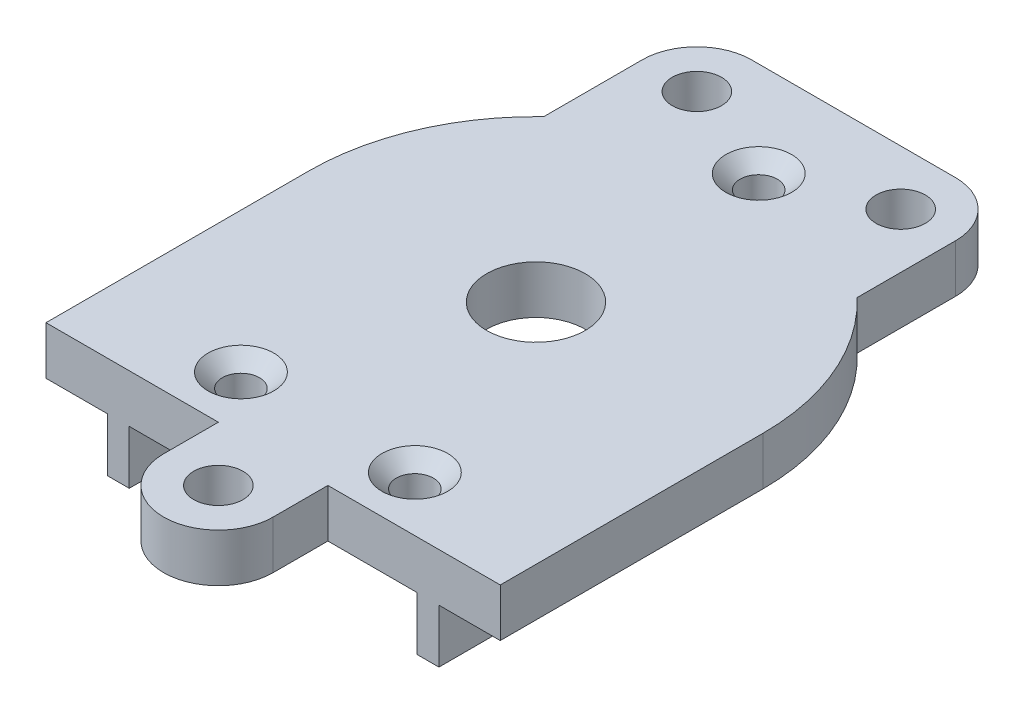
ISO-10303-21;
HEADER;
FILE_DESCRIPTION(('STEP AP214'),'2;1');
FILE_NAME('part.step','',(''),(''),'','','');
FILE_SCHEMA(('AUTOMOTIVE_DESIGN { 1 0 10303 214 1 1 1 1 }'));
ENDSEC;
DATA;
#1=APPLICATION_CONTEXT('core data for automotive mechanical design processes');
#2=APPLICATION_PROTOCOL_DEFINITION('international standard','automotive_design',2000,#1);
#3=PRODUCT_CONTEXT('',#1,'mechanical');
#4=PRODUCT('Part','Part','',(#3));
#5=PRODUCT_RELATED_PRODUCT_CATEGORY('part','',(#4));
#6=PRODUCT_DEFINITION_FORMATION('','',#4);
#7=PRODUCT_DEFINITION_CONTEXT('part definition',#1,'design');
#8=PRODUCT_DEFINITION('design','',#6,#7);
#9=PRODUCT_DEFINITION_SHAPE('','',#8);
#10=(LENGTH_UNIT() NAMED_UNIT(*) SI_UNIT(.MILLI.,.METRE.));
#11=(NAMED_UNIT(*) PLANE_ANGLE_UNIT() SI_UNIT($,.RADIAN.));
#12=(NAMED_UNIT(*) SI_UNIT($,.STERADIAN.) SOLID_ANGLE_UNIT());
#13=UNCERTAINTY_MEASURE_WITH_UNIT(LENGTH_MEASURE(1.E-05),#10,'distance_accuracy_value','');
#14=(GEOMETRIC_REPRESENTATION_CONTEXT(3) GLOBAL_UNCERTAINTY_ASSIGNED_CONTEXT((#13)) GLOBAL_UNIT_ASSIGNED_CONTEXT((#10,
#11,#12)) REPRESENTATION_CONTEXT('',''));
#15=CARTESIAN_POINT('',(0.,0.,0.));
#16=DIRECTION('',(0.,0.,1.));
#17=DIRECTION('',(1.,0.,0.));
#18=AXIS2_PLACEMENT_3D('',#15,#16,#17);
#19=CARTESIAN_POINT('',(0.,5.3,0.));
#20=DIRECTION('',(0.,1.,0.));
#21=DIRECTION('',(0.,0.,1.));
#22=AXIS2_PLACEMENT_3D('',#19,#20,#21);
#23=PLANE('',#22);
#24=CARTESIAN_POINT('',(-4.65334875921136,5.3,-11.9993018682399));
#25=DIRECTION('',(0.,-1.,0.));
#26=DIRECTION('',(0.,0.,-1.));
#27=AXIS2_PLACEMENT_3D('',#24,#25,#26);
#28=CIRCLE('',#27,1.49999954);
#29=CARTESIAN_POINT('',(-4.65334875921136,5.3,-13.4993014082399));
#30=VERTEX_POINT('',#29);
#31=EDGE_CURVE('E1128',#30,#30,#28,.T.);
#32=ORIENTED_EDGE('',*,*,#31,.F.);
#33=EDGE_LOOP('',(#32));
#34=FACE_BOUND('',#33,.T.);
#35=DIRECTION('',(0.,0.,1.));
#36=VECTOR('',#35,1.);
#37=CARTESIAN_POINT('',(7.15334875921134,5.3,0.));
#38=LINE('',#37,#36);
#39=CARTESIAN_POINT('',(7.15334875921136,5.3,-11.9993018682399));
#40=VERTEX_POINT('',#39);
#41=CARTESIAN_POINT('',(7.15334875921135,5.3,-7.50776275125216));
#42=VERTEX_POINT('',#41);
#43=EDGE_CURVE('E249',#40,#42,#38,.T.);
#44=ORIENTED_EDGE('',*,*,#43,.T.);
#45=CARTESIAN_POINT('',(0.,5.3,0.));
#46=DIRECTION('',(0.,1.,0.));
#47=DIRECTION('',(0.,0.,1.));
#48=AXIS2_PLACEMENT_3D('',#45,#46,#47);
#49=CIRCLE('',#48,10.37);
#50=CARTESIAN_POINT('',(10.37,5.3,0.));
#51=VERTEX_POINT('',#50);
#52=EDGE_CURVE('E427',#51,#42,#49,.T.);
#53=ORIENTED_EDGE('',*,*,#52,.F.);
#54=DIRECTION('',(0.,0.,1.));
#55=VECTOR('',#54,1.);
#56=CARTESIAN_POINT('',(10.37,5.3,0.));
#57=LINE('',#56,#55);
#58=CARTESIAN_POINT('',(10.37,5.3,12.));
#59=VERTEX_POINT('',#58);
#60=EDGE_CURVE('E421',#51,#59,#57,.T.);
#61=ORIENTED_EDGE('',*,*,#60,.T.);
#62=DIRECTION('',(1.,0.,0.));
#63=VECTOR('',#62,1.);
#64=CARTESIAN_POINT('',(-10.37,5.3,12.));
#65=LINE('',#64,#63);
#66=CARTESIAN_POINT('',(7.56999999999999,5.3,12.));
#67=VERTEX_POINT('',#66);
#68=EDGE_CURVE('E449',#67,#59,#65,.T.);
#69=ORIENTED_EDGE('',*,*,#68,.F.);
#70=DIRECTION('',(0.,0.,1.));
#71=VECTOR('',#70,1.);
#72=CARTESIAN_POINT('',(7.57,5.3,0.));
#73=LINE('',#72,#71);
#74=CARTESIAN_POINT('',(7.57,5.3,0.));
#75=VERTEX_POINT('',#74);
#76=EDGE_CURVE('E375',#75,#67,#73,.T.);
#77=ORIENTED_EDGE('',*,*,#76,.F.);
#78=CARTESIAN_POINT('',(0.,5.3,0.));
#79=DIRECTION('',(0.,-1.,0.));
#80=DIRECTION('',(0.,0.,-1.));
#81=AXIS2_PLACEMENT_3D('',#78,#79,#80);
#82=CIRCLE('',#81,7.57);
#83=CARTESIAN_POINT('',(-7.57,5.3,0.));
#84=VERTEX_POINT('',#83);
#85=EDGE_CURVE('E371',#84,#75,#82,.T.);
#86=ORIENTED_EDGE('',*,*,#85,.F.);
#87=DIRECTION('',(0.,0.,1.));
#88=VECTOR('',#87,1.);
#89=CARTESIAN_POINT('',(-7.57,5.3,0.));
#90=LINE('',#89,#88);
#91=CARTESIAN_POINT('',(-7.57,5.3,12.));
#92=VERTEX_POINT('',#91);
#93=EDGE_CURVE('E338',#84,#92,#90,.T.);
#94=ORIENTED_EDGE('',*,*,#93,.T.);
#95=CARTESIAN_POINT('',(-10.37,5.3,12.));
#96=VERTEX_POINT('',#95);
#97=EDGE_CURVE('E450',#96,#92,#65,.T.);
#98=ORIENTED_EDGE('',*,*,#97,.F.);
#99=DIRECTION('',(0.,0.,1.));
#100=VECTOR('',#99,1.);
#101=CARTESIAN_POINT('',(-10.37,5.3,0.));
#102=LINE('',#101,#100);
#103=CARTESIAN_POINT('',(-10.37,5.3,0.));
#104=VERTEX_POINT('',#103);
#105=EDGE_CURVE('E438',#104,#96,#102,.T.);
#106=ORIENTED_EDGE('',*,*,#105,.F.);
#107=CARTESIAN_POINT('',(-7.15334875921136,5.3,-7.50776275125215));
#108=VERTEX_POINT('',#107);
#109=EDGE_CURVE('E431',#108,#104,#49,.T.);
#110=ORIENTED_EDGE('',*,*,#109,.F.);
#111=DIRECTION('',(0.,0.,1.));
#112=VECTOR('',#111,1.);
#113=CARTESIAN_POINT('',(-7.15334875921136,5.3,0.));
#114=LINE('',#113,#112);
#115=CARTESIAN_POINT('',(-7.15334875921136,5.3,-11.9993018682399));
#116=VERTEX_POINT('',#115);
#117=EDGE_CURVE('E269',#116,#108,#114,.T.);
#118=ORIENTED_EDGE('',*,*,#117,.F.);
#119=CARTESIAN_POINT('',(-4.65334875921136,5.3,-11.9993018682399));
#120=DIRECTION('',(0.,-1.,0.));
#121=DIRECTION('',(0.,0.,-1.));
#122=AXIS2_PLACEMENT_3D('',#119,#120,#121);
#123=CIRCLE('',#122,2.5);
#124=CARTESIAN_POINT('',(-4.65334875921136,5.3,-14.4993018682399));
#125=VERTEX_POINT('',#124);
#126=EDGE_CURVE('E264',#116,#125,#123,.T.);
#127=ORIENTED_EDGE('',*,*,#126,.T.);
#128=DIRECTION('',(1.,0.,0.));
#129=VECTOR('',#128,1.);
#130=CARTESIAN_POINT('',(0.,5.3,-14.4993018682399));
#131=LINE('',#130,#129);
#132=CARTESIAN_POINT('',(4.65334875921136,5.3,-14.4993018682399));
#133=VERTEX_POINT('',#132);
#134=EDGE_CURVE('E254',#125,#133,#131,.T.);
#135=ORIENTED_EDGE('',*,*,#134,.T.);
#136=CARTESIAN_POINT('',(4.65334875921136,5.3,-11.9993018682399));
#137=DIRECTION('',(0.,-1.,0.));
#138=DIRECTION('',(0.,0.,-1.));
#139=AXIS2_PLACEMENT_3D('',#136,#137,#138);
#140=CIRCLE('',#139,2.5);
#141=EDGE_CURVE('E255',#40,#133,#140,.F.);
#142=ORIENTED_EDGE('',*,*,#141,.F.);
#143=EDGE_LOOP('',(#44,#53,#61,#69,#77,#86,#94,#98,#106,#110,#118,#127,#135,#142));
#144=FACE_BOUND('',#143,.T.);
#145=CARTESIAN_POINT('',(0.,5.3,-10.17));
#146=DIRECTION('',(0.,1.,0.));
#147=DIRECTION('',(0.,0.,1.));
#148=AXIS2_PLACEMENT_3D('',#145,#146,#147);
#149=CIRCLE('',#148,0.849999950999993);
#150=CARTESIAN_POINT('',(0.,5.3,-9.32000004900001));
#151=VERTEX_POINT('',#150);
#152=EDGE_CURVE('E329',#151,#151,#149,.T.);
#153=ORIENTED_EDGE('',*,*,#152,.T.);
#154=EDGE_LOOP('',(#153));
#155=FACE_BOUND('',#154,.T.);
#156=CARTESIAN_POINT('',(4.65334875921136,5.3,-11.9993018682399));
#157=DIRECTION('',(0.,-1.,0.));
#158=DIRECTION('',(0.,0.,-1.));
#159=AXIS2_PLACEMENT_3D('',#156,#157,#158);
#160=CIRCLE('',#159,1.49999954);
#161=CARTESIAN_POINT('',(4.65334875921136,5.3,-13.4993014082399));
#162=VERTEX_POINT('',#161);
#163=EDGE_CURVE('E490',#162,#162,#160,.T.);
#164=ORIENTED_EDGE('',*,*,#163,.F.);
#165=EDGE_LOOP('',(#164));
#166=FACE_BOUND('',#165,.T.);
#167=ADVANCED_FACE('F45',(#34,#144,#155,#166),#23,.F.);
#168=CARTESIAN_POINT('',(-10.37,7.5,12.));
#169=DIRECTION('',(0.,0.,-1.));
#170=DIRECTION('',(-1.,0.,0.));
#171=AXIS2_PLACEMENT_3D('',#168,#169,#170);
#172=PLANE('',#171);
#173=DIRECTION('',(0.,-1.,0.));
#174=VECTOR('',#173,1.);
#175=CARTESIAN_POINT('',(-2.5,14.5710678118655,12.));
#176=LINE('',#175,#174);
#177=CARTESIAN_POINT('',(-2.5,7.5,12.));
#178=VERTEX_POINT('',#177);
#179=CARTESIAN_POINT('',(-2.5,5.3,12.));
#180=VERTEX_POINT('',#179);
#181=EDGE_CURVE('E71',#178,#180,#176,.T.);
#182=ORIENTED_EDGE('',*,*,#181,.F.);
#183=DIRECTION('',(1.,0.,0.));
#184=VECTOR('',#183,1.);
#185=CARTESIAN_POINT('',(-10.37,7.5,12.));
#186=LINE('',#185,#184);
#187=CARTESIAN_POINT('',(-10.37,7.5,12.));
#188=VERTEX_POINT('',#187);
#189=EDGE_CURVE('E439',#188,#178,#186,.T.);
#190=ORIENTED_EDGE('',*,*,#189,.F.);
#191=DIRECTION('',(0.,-1.,0.));
#192=VECTOR('',#191,1.);
#193=CARTESIAN_POINT('',(-10.37,7.5,12.));
#194=LINE('',#193,#192);
#195=EDGE_CURVE('E457',#188,#96,#194,.T.);
#196=ORIENTED_EDGE('',*,*,#195,.T.);
#197=ORIENTED_EDGE('',*,*,#97,.T.);
#198=DIRECTION('',(0.,1.,0.));
#199=VECTOR('',#198,1.);
#200=CARTESIAN_POINT('',(-7.57,2.85,12.));
#201=LINE('',#200,#199);
#202=CARTESIAN_POINT('',(-7.57,2.85,12.));
#203=VERTEX_POINT('',#202);
#204=EDGE_CURVE('E368',#203,#92,#201,.T.);
#205=ORIENTED_EDGE('',*,*,#204,.F.);
#206=DIRECTION('',(-1.,0.,0.));
#207=VECTOR('',#206,1.);
#208=CARTESIAN_POINT('',(0.,2.85,12.));
#209=LINE('',#208,#207);
#210=CARTESIAN_POINT('',(-6.57,2.85,12.));
#211=VERTEX_POINT('',#210);
#212=EDGE_CURVE('E361',#211,#203,#209,.T.);
#213=ORIENTED_EDGE('',*,*,#212,.F.);
#214=DIRECTION('',(0.,1.,0.));
#215=VECTOR('',#214,1.);
#216=CARTESIAN_POINT('',(-6.57,2.85,12.));
#217=LINE('',#216,#215);
#218=CARTESIAN_POINT('',(-6.57,5.3,12.));
#219=VERTEX_POINT('',#218);
#220=EDGE_CURVE('E393',#211,#219,#217,.T.);
#221=ORIENTED_EDGE('',*,*,#220,.T.);
#222=EDGE_CURVE('E454',#219,#180,#65,.T.);
#223=ORIENTED_EDGE('',*,*,#222,.T.);
#224=EDGE_LOOP('',(#182,#190,#196,#197,#205,#213,#221,#223));
#225=FACE_BOUND('',#224,.T.);
#226=ADVANCED_FACE('F542',(#225),#172,.F.);
#227=CARTESIAN_POINT('',(0.,7.5,0.));
#228=DIRECTION('',(0.,-1.,0.));
#229=DIRECTION('',(0.,0.,-1.));
#230=AXIS2_PLACEMENT_3D('',#227,#228,#229);
#231=CYLINDRICAL_SURFACE('',#230,10.37);
#232=DIRECTION('',(0.,-1.,0.));
#233=VECTOR('',#232,1.);
#234=CARTESIAN_POINT('',(-7.15334875921136,23.4236683307589,-7.50776275125215));
#235=LINE('',#234,#233);
#236=CARTESIAN_POINT('',(-7.15334875921136,7.5,-7.50776275125215));
#237=VERTEX_POINT('',#236);
#238=EDGE_CURVE('E268',#237,#108,#235,.T.);
#239=ORIENTED_EDGE('',*,*,#238,.T.);
#240=ORIENTED_EDGE('',*,*,#109,.T.);
#241=DIRECTION('',(0.,-1.,0.));
#242=VECTOR('',#241,1.);
#243=CARTESIAN_POINT('',(-10.37,7.5,0.));
#244=LINE('',#243,#242);
#245=CARTESIAN_POINT('',(-10.37,7.5,0.));
#246=VERTEX_POINT('',#245);
#247=EDGE_CURVE('E11',#246,#104,#244,.T.);
#248=ORIENTED_EDGE('',*,*,#247,.F.);
#249=CARTESIAN_POINT('',(0.,7.5,0.));
#250=DIRECTION('',(0.,1.,0.));
#251=DIRECTION('',(0.,0.,1.));
#252=AXIS2_PLACEMENT_3D('',#249,#250,#251);
#253=CIRCLE('',#252,10.37);
#254=EDGE_CURVE('E426',#237,#246,#253,.T.);
#255=ORIENTED_EDGE('',*,*,#254,.F.);
#256=EDGE_LOOP('',(#239,#240,#248,#255));
#257=FACE_BOUND('',#256,.T.);
#258=ADVANCED_FACE('F549',(#257),#231,.T.);
#259=ORIENTED_EDGE('',*,*,#52,.T.);
#260=DIRECTION('',(0.,-1.,0.));
#261=VECTOR('',#260,1.);
#262=CARTESIAN_POINT('',(7.15334875921135,23.4236683307589,-7.50776275125216));
#263=LINE('',#262,#261);
#264=CARTESIAN_POINT('',(7.15334875921135,7.5,-7.50776275125216));
#265=VERTEX_POINT('',#264);
#266=EDGE_CURVE('E290',#265,#42,#263,.T.);
#267=ORIENTED_EDGE('',*,*,#266,.F.);
#268=CARTESIAN_POINT('',(10.37,7.5,0.));
#269=VERTEX_POINT('',#268);
#270=EDGE_CURVE('E422',#269,#265,#253,.T.);
#271=ORIENTED_EDGE('',*,*,#270,.F.);
#272=DIRECTION('',(0.,-1.,0.));
#273=VECTOR('',#272,1.);
#274=CARTESIAN_POINT('',(10.37,7.5,0.));
#275=LINE('',#274,#273);
#276=EDGE_CURVE('E55',#269,#51,#275,.T.);
#277=ORIENTED_EDGE('',*,*,#276,.T.);
#278=EDGE_LOOP('',(#259,#267,#271,#277));
#279=FACE_BOUND('',#278,.T.);
#280=ADVANCED_FACE('F518',(#279),#231,.T.);
#281=CARTESIAN_POINT('',(0.,5.3,14.5));
#282=DIRECTION('',(0.,-1.,0.));
#283=DIRECTION('',(0.,0.,-1.));
#284=AXIS2_PLACEMENT_3D('',#281,#282,#283);
#285=CIRCLE('',#284,1.49999954);
#286=CARTESIAN_POINT('',(0.,5.3,13.00000046));
#287=VERTEX_POINT('',#286);
#288=EDGE_CURVE('E479',#287,#287,#285,.T.);
#289=ORIENTED_EDGE('',*,*,#288,.F.);
#290=EDGE_LOOP('',(#289));
#291=FACE_BOUND('',#290,.T.);
#292=CARTESIAN_POINT('',(-3.97,5.3,9.5));
#293=DIRECTION('',(0.,1.,0.));
#294=DIRECTION('',(0.,0.,1.));
#295=AXIS2_PLACEMENT_3D('',#292,#293,#294);
#296=CIRCLE('',#295,0.849999950999993);
#297=CARTESIAN_POINT('',(-3.97,5.3,10.349999951));
#298=VERTEX_POINT('',#297);
#299=EDGE_CURVE('E311',#298,#298,#296,.T.);
#300=ORIENTED_EDGE('',*,*,#299,.T.);
#301=EDGE_LOOP('',(#300));
#302=FACE_BOUND('',#301,.T.);
#303=CARTESIAN_POINT('',(3.97000000000001,5.3,9.50000000000002));
#304=DIRECTION('',(0.,1.,0.));
#305=DIRECTION('',(0.,0.,1.));
#306=AXIS2_PLACEMENT_3D('',#303,#304,#305);
#307=CIRCLE('',#306,0.849999950999994);
#308=CARTESIAN_POINT('',(3.97000000000001,5.3,10.349999951));
#309=VERTEX_POINT('',#308);
#310=EDGE_CURVE('E320',#309,#309,#307,.T.);
#311=ORIENTED_EDGE('',*,*,#310,.T.);
#312=EDGE_LOOP('',(#311));
#313=FACE_BOUND('',#312,.T.);
#314=ORIENTED_EDGE('',*,*,#222,.F.);
#315=DIRECTION('',(0.,0.,-1.));
#316=VECTOR('',#315,1.);
#317=CARTESIAN_POINT('',(-6.57,5.3,0.));
#318=LINE('',#317,#316);
#319=CARTESIAN_POINT('',(-6.57,5.3,3.76031913539264));
#320=VERTEX_POINT('',#319);
#321=EDGE_CURVE('E384',#219,#320,#318,.T.);
#322=ORIENTED_EDGE('',*,*,#321,.T.);
#323=CARTESIAN_POINT('',(6.57,5.3,3.76031913539263));
#324=VERTEX_POINT('',#323);
#325=EDGE_CURVE('E376',#324,#320,#82,.T.);
#326=ORIENTED_EDGE('',*,*,#325,.F.);
#327=DIRECTION('',(0.,0.,-1.));
#328=VECTOR('',#327,1.);
#329=CARTESIAN_POINT('',(6.57,5.3,0.));
#330=LINE('',#329,#328);
#331=CARTESIAN_POINT('',(6.57,5.3,12.));
#332=VERTEX_POINT('',#331);
#333=EDGE_CURVE('E380',#332,#324,#330,.T.);
#334=ORIENTED_EDGE('',*,*,#333,.F.);
#335=CARTESIAN_POINT('',(2.5,5.3,12.));
#336=VERTEX_POINT('',#335);
#337=EDGE_CURVE('E218',#336,#332,#65,.T.);
#338=ORIENTED_EDGE('',*,*,#337,.F.);
#339=DIRECTION('',(0.,0.,-1.));
#340=VECTOR('',#339,1.);
#341=CARTESIAN_POINT('',(2.5,5.3,0.));
#342=LINE('',#341,#340);
#343=CARTESIAN_POINT('',(2.5,5.3,14.5));
#344=VERTEX_POINT('',#343);
#345=EDGE_CURVE('E203',#344,#336,#342,.T.);
#346=ORIENTED_EDGE('',*,*,#345,.F.);
#347=CARTESIAN_POINT('',(0.,5.3,14.5));
#348=DIRECTION('',(0.,-1.,0.));
#349=DIRECTION('',(0.,0.,-1.));
#350=AXIS2_PLACEMENT_3D('',#347,#348,#349);
#351=CIRCLE('',#350,2.5);
#352=CARTESIAN_POINT('',(-2.5,5.3,14.5));
#353=VERTEX_POINT('',#352);
#354=EDGE_CURVE('E216',#344,#353,#351,.T.);
#355=ORIENTED_EDGE('',*,*,#354,.T.);
#356=DIRECTION('',(0.,0.,-1.));
#357=VECTOR('',#356,1.);
#358=CARTESIAN_POINT('',(-2.5,5.3,0.));
#359=LINE('',#358,#357);
#360=EDGE_CURVE('E227',#353,#180,#359,.T.);
#361=ORIENTED_EDGE('',*,*,#360,.T.);
#362=EDGE_LOOP('',(#314,#322,#326,#334,#338,#346,#355,#361));
#363=FACE_BOUND('',#362,.T.);
#364=ADVANCED_FACE('F214',(#291,#302,#313,#363),#23,.F.);
#365=CARTESIAN_POINT('',(0.,5.3,0.));
#366=DIRECTION('',(0.,1.,0.));
#367=DIRECTION('',(0.,0.,1.));
#368=AXIS2_PLACEMENT_3D('',#365,#366,#367);
#369=CIRCLE('',#368,2.25);
#370=CARTESIAN_POINT('',(0.,5.3,2.25));
#371=VERTEX_POINT('',#370);
#372=EDGE_CURVE('E334',#371,#371,#369,.F.);
#373=ORIENTED_EDGE('',*,*,#372,.F.);
#374=EDGE_LOOP('',(#373));
#375=FACE_BOUND('',#374,.T.);
#376=CARTESIAN_POINT('',(0.,5.3,0.));
#377=DIRECTION('',(0.,-1.,0.));
#378=DIRECTION('',(0.,0.,-1.));
#379=AXIS2_PLACEMENT_3D('',#376,#377,#378);
#380=CIRCLE('',#379,6.735);
#381=CARTESIAN_POINT('',(0.,5.3,-6.735));
#382=VERTEX_POINT('',#381);
#383=EDGE_CURVE('E344',#382,#382,#380,.T.);
#384=ORIENTED_EDGE('',*,*,#383,.T.);
#385=EDGE_LOOP('',(#384));
#386=FACE_BOUND('',#385,.T.);
#387=ADVANCED_FACE('F517',(#375,#386),#23,.F.);
#388=CARTESIAN_POINT('',(0.,7.5,0.));
#389=DIRECTION('',(0.,1.,0.));
#390=DIRECTION('',(0.,0.,1.));
#391=AXIS2_PLACEMENT_3D('',#388,#389,#390);
#392=PLANE('',#391);
#393=CARTESIAN_POINT('',(-4.65334875921136,7.5,-11.9993018682399));
#394=DIRECTION('',(0.,1.,0.));
#395=DIRECTION('',(0.,0.,1.));
#396=AXIS2_PLACEMENT_3D('',#393,#394,#395);
#397=CIRCLE('',#396,1.125000036);
#398=CARTESIAN_POINT('',(-4.65334875921136,7.5,-10.8743018322399));
#399=VERTEX_POINT('',#398);
#400=EDGE_CURVE('E49',#399,#399,#397,.T.);
#401=ORIENTED_EDGE('',*,*,#400,.F.);
#402=EDGE_LOOP('',(#401));
#403=FACE_BOUND('',#402,.T.);
#404=CARTESIAN_POINT('',(4.65334875921136,7.5,-11.9993018682399));
#405=DIRECTION('',(0.,1.,0.));
#406=DIRECTION('',(0.,0.,1.));
#407=AXIS2_PLACEMENT_3D('',#404,#405,#406);
#408=CIRCLE('',#407,1.125000036);
#409=CARTESIAN_POINT('',(4.65334875921136,7.5,-10.8743018322399));
#410=VERTEX_POINT('',#409);
#411=EDGE_CURVE('E476',#410,#410,#408,.T.);
#412=ORIENTED_EDGE('',*,*,#411,.F.);
#413=EDGE_LOOP('',(#412));
#414=FACE_BOUND('',#413,.T.);
#415=CARTESIAN_POINT('',(0.,7.5,14.5));
#416=DIRECTION('',(0.,1.,0.));
#417=DIRECTION('',(0.,0.,1.));
#418=AXIS2_PLACEMENT_3D('',#415,#416,#417);
#419=CIRCLE('',#418,1.125000036);
#420=CARTESIAN_POINT('',(0.,7.5,15.625000036));
#421=VERTEX_POINT('',#420);
#422=EDGE_CURVE('E234',#421,#421,#419,.T.);
#423=ORIENTED_EDGE('',*,*,#422,.F.);
#424=EDGE_LOOP('',(#423));
#425=FACE_BOUND('',#424,.T.);
#426=ORIENTED_EDGE('',*,*,#270,.T.);
#427=DIRECTION('',(0.,0.,1.));
#428=VECTOR('',#427,1.);
#429=CARTESIAN_POINT('',(7.15334875921134,7.5,0.));
#430=LINE('',#429,#428);
#431=CARTESIAN_POINT('',(7.15334875921136,7.5,-11.9993018682399));
#432=VERTEX_POINT('',#431);
#433=EDGE_CURVE('E248',#432,#265,#430,.T.);
#434=ORIENTED_EDGE('',*,*,#433,.F.);
#435=CARTESIAN_POINT('',(4.65334875921136,7.5,-11.9993018682399));
#436=DIRECTION('',(0.,1.,0.));
#437=DIRECTION('',(0.,0.,1.));
#438=AXIS2_PLACEMENT_3D('',#435,#436,#437);
#439=CIRCLE('',#438,2.5);
#440=CARTESIAN_POINT('',(4.65334875921136,7.5,-14.4993018682399));
#441=VERTEX_POINT('',#440);
#442=EDGE_CURVE('E253',#432,#441,#439,.T.);
#443=ORIENTED_EDGE('',*,*,#442,.T.);
#444=DIRECTION('',(1.,0.,0.));
#445=VECTOR('',#444,1.);
#446=CARTESIAN_POINT('',(0.,7.5,-14.4993018682399));
#447=LINE('',#446,#445);
#448=CARTESIAN_POINT('',(-4.65334875921136,7.5,-14.4993018682399));
#449=VERTEX_POINT('',#448);
#450=EDGE_CURVE('E259',#449,#441,#447,.T.);
#451=ORIENTED_EDGE('',*,*,#450,.F.);
#452=CARTESIAN_POINT('',(-4.65334875921136,7.5,-11.9993018682399));
#453=DIRECTION('',(0.,1.,0.));
#454=DIRECTION('',(0.,0.,1.));
#455=AXIS2_PLACEMENT_3D('',#452,#453,#454);
#456=CIRCLE('',#455,2.5);
#457=CARTESIAN_POINT('',(-7.15334875921136,7.5,-11.9993018682399));
#458=VERTEX_POINT('',#457);
#459=EDGE_CURVE('E278',#458,#449,#456,.F.);
#460=ORIENTED_EDGE('',*,*,#459,.F.);
#461=DIRECTION('',(0.,0.,1.));
#462=VECTOR('',#461,1.);
#463=CARTESIAN_POINT('',(-7.15334875921136,7.5,0.));
#464=LINE('',#463,#462);
#465=EDGE_CURVE('E273',#458,#237,#464,.T.);
#466=ORIENTED_EDGE('',*,*,#465,.T.);
#467=ORIENTED_EDGE('',*,*,#254,.T.);
#468=DIRECTION('',(0.,0.,1.));
#469=VECTOR('',#468,1.);
#470=CARTESIAN_POINT('',(-10.37,7.5,0.));
#471=LINE('',#470,#469);
#472=EDGE_CURVE('E442',#246,#188,#471,.T.);
#473=ORIENTED_EDGE('',*,*,#472,.T.);
#474=ORIENTED_EDGE('',*,*,#189,.T.);
#475=DIRECTION('',(0.,0.,-1.));
#476=VECTOR('',#475,1.);
#477=CARTESIAN_POINT('',(-2.5,7.5,0.));
#478=LINE('',#477,#476);
#479=CARTESIAN_POINT('',(-2.5,7.5,14.5));
#480=VERTEX_POINT('',#479);
#481=EDGE_CURVE('E231',#480,#178,#478,.T.);
#482=ORIENTED_EDGE('',*,*,#481,.F.);
#483=CARTESIAN_POINT('',(0.,7.5,14.5));
#484=DIRECTION('',(0.,1.,0.));
#485=DIRECTION('',(0.,0.,1.));
#486=AXIS2_PLACEMENT_3D('',#483,#484,#485);
#487=CIRCLE('',#486,2.5);
#488=CARTESIAN_POINT('',(2.5,7.5,14.5));
#489=VERTEX_POINT('',#488);
#490=EDGE_CURVE('E220',#489,#480,#487,.F.);
#491=ORIENTED_EDGE('',*,*,#490,.F.);
#492=DIRECTION('',(0.,0.,-1.));
#493=VECTOR('',#492,1.);
#494=CARTESIAN_POINT('',(2.5,7.5,0.));
#495=LINE('',#494,#493);
#496=CARTESIAN_POINT('',(2.5,7.5,12.));
#497=VERTEX_POINT('',#496);
#498=EDGE_CURVE('E204',#489,#497,#495,.T.);
#499=ORIENTED_EDGE('',*,*,#498,.T.);
#500=CARTESIAN_POINT('',(10.37,7.5,12.));
#501=VERTEX_POINT('',#500);
#502=EDGE_CURVE('E63',#497,#501,#186,.T.);
#503=ORIENTED_EDGE('',*,*,#502,.T.);
#504=DIRECTION('',(0.,0.,1.));
#505=VECTOR('',#504,1.);
#506=CARTESIAN_POINT('',(10.37,7.5,0.));
#507=LINE('',#506,#505);
#508=EDGE_CURVE('E434',#269,#501,#507,.T.);
#509=ORIENTED_EDGE('',*,*,#508,.F.);
#510=EDGE_LOOP('',(#426,#434,#443,#451,#460,#466,#467,#473,#474,#482,#491,#499,#503,#509));
#511=FACE_BOUND('',#510,.T.);
#512=CARTESIAN_POINT('',(-3.97,7.5,9.5));
#513=DIRECTION('',(0.,1.,0.));
#514=DIRECTION('',(0.,0.,1.));
#515=AXIS2_PLACEMENT_3D('',#512,#513,#514);
#516=CIRCLE('',#515,1.49999954);
#517=CARTESIAN_POINT('',(-3.97,7.5,10.99999954));
#518=VERTEX_POINT('',#517);
#519=EDGE_CURVE('E277',#518,#518,#516,.T.);
#520=ORIENTED_EDGE('',*,*,#519,.F.);
#521=EDGE_LOOP('',(#520));
#522=FACE_BOUND('',#521,.T.);
#523=CARTESIAN_POINT('',(3.97000000000001,7.5,9.50000000000002));
#524=DIRECTION('',(0.,1.,0.));
#525=DIRECTION('',(0.,0.,1.));
#526=AXIS2_PLACEMENT_3D('',#523,#524,#525);
#527=CIRCLE('',#526,1.49999954);
#528=CARTESIAN_POINT('',(3.97000000000001,7.5,10.99999954));
#529=VERTEX_POINT('',#528);
#530=EDGE_CURVE('E312',#529,#529,#527,.T.);
#531=ORIENTED_EDGE('',*,*,#530,.F.);
#532=EDGE_LOOP('',(#531));
#533=FACE_BOUND('',#532,.T.);
#534=CARTESIAN_POINT('',(0.,7.5,-10.17));
#535=DIRECTION('',(0.,1.,0.));
#536=DIRECTION('',(0.,0.,1.));
#537=AXIS2_PLACEMENT_3D('',#534,#535,#536);
#538=CIRCLE('',#537,1.49999954);
#539=CARTESIAN_POINT('',(0.,7.5,-8.67000046));
#540=VERTEX_POINT('',#539);
#541=EDGE_CURVE('E321',#540,#540,#538,.T.);
#542=ORIENTED_EDGE('',*,*,#541,.F.);
#543=EDGE_LOOP('',(#542));
#544=FACE_BOUND('',#543,.T.);
#545=CARTESIAN_POINT('',(0.,7.5,0.));
#546=DIRECTION('',(0.,1.,0.));
#547=DIRECTION('',(0.,0.,1.));
#548=AXIS2_PLACEMENT_3D('',#545,#546,#547);
#549=CIRCLE('',#548,2.25);
#550=CARTESIAN_POINT('',(0.,7.5,2.25));
#551=VERTEX_POINT('',#550);
#552=EDGE_CURVE('E330',#551,#551,#549,.T.);
#553=ORIENTED_EDGE('',*,*,#552,.F.);
#554=EDGE_LOOP('',(#553));
#555=FACE_BOUND('',#554,.T.);
#556=ADVANCED_FACE('F556',(#403,#414,#425,#511,#522,#533,#544,#555),#392,.T.);
#557=CARTESIAN_POINT('',(-10.37,7.5,0.));
#558=DIRECTION('',(1.,0.,0.));
#559=DIRECTION('',(0.,0.,-1.));
#560=AXIS2_PLACEMENT_3D('',#557,#558,#559);
#561=PLANE('',#560);
#562=ORIENTED_EDGE('',*,*,#105,.T.);
#563=ORIENTED_EDGE('',*,*,#195,.F.);
#564=ORIENTED_EDGE('',*,*,#472,.F.);
#565=ORIENTED_EDGE('',*,*,#247,.T.);
#566=EDGE_LOOP('',(#562,#563,#564,#565));
#567=FACE_BOUND('',#566,.T.);
#568=ADVANCED_FACE('F563',(#567),#561,.F.);
#569=ORIENTED_EDGE('',*,*,#502,.F.);
#570=DIRECTION('',(0.,-1.,0.));
#571=VECTOR('',#570,1.);
#572=CARTESIAN_POINT('',(2.5,14.5710678118655,12.));
#573=LINE('',#572,#571);
#574=EDGE_CURVE('E209',#497,#336,#573,.T.);
#575=ORIENTED_EDGE('',*,*,#574,.T.);
#576=ORIENTED_EDGE('',*,*,#337,.T.);
#577=DIRECTION('',(0.,1.,0.));
#578=VECTOR('',#577,1.);
#579=CARTESIAN_POINT('',(6.57,2.85,12.));
#580=LINE('',#579,#578);
#581=CARTESIAN_POINT('',(6.57,2.85,12.));
#582=VERTEX_POINT('',#581);
#583=EDGE_CURVE('E405',#582,#332,#580,.T.);
#584=ORIENTED_EDGE('',*,*,#583,.F.);
#585=DIRECTION('',(-1.,0.,0.));
#586=VECTOR('',#585,1.);
#587=CARTESIAN_POINT('',(0.,2.85,12.));
#588=LINE('',#587,#586);
#589=CARTESIAN_POINT('',(7.57,2.85,12.));
#590=VERTEX_POINT('',#589);
#591=EDGE_CURVE('E351',#590,#582,#588,.T.);
#592=ORIENTED_EDGE('',*,*,#591,.F.);
#593=DIRECTION('',(0.,1.,0.));
#594=VECTOR('',#593,1.);
#595=CARTESIAN_POINT('',(7.57,2.85,12.));
#596=LINE('',#595,#594);
#597=EDGE_CURVE('E409',#590,#67,#596,.T.);
#598=ORIENTED_EDGE('',*,*,#597,.T.);
#599=ORIENTED_EDGE('',*,*,#68,.T.);
#600=DIRECTION('',(0.,-1.,0.));
#601=VECTOR('',#600,1.);
#602=CARTESIAN_POINT('',(10.37,7.5,12.));
#603=LINE('',#602,#601);
#604=EDGE_CURVE('E445',#501,#59,#603,.T.);
#605=ORIENTED_EDGE('',*,*,#604,.F.);
#606=EDGE_LOOP('',(#569,#575,#576,#584,#592,#598,#599,#605));
#607=FACE_BOUND('',#606,.T.);
#608=ADVANCED_FACE('F550',(#607),#172,.F.);
#609=CARTESIAN_POINT('',(10.37,7.5,0.));
#610=DIRECTION('',(1.,0.,0.));
#611=DIRECTION('',(0.,0.,-1.));
#612=AXIS2_PLACEMENT_3D('',#609,#610,#611);
#613=PLANE('',#612);
#614=ORIENTED_EDGE('',*,*,#60,.F.);
#615=ORIENTED_EDGE('',*,*,#276,.F.);
#616=ORIENTED_EDGE('',*,*,#508,.T.);
#617=ORIENTED_EDGE('',*,*,#604,.T.);
#618=EDGE_LOOP('',(#614,#615,#616,#617));
#619=FACE_BOUND('',#618,.T.);
#620=ADVANCED_FACE('F47',(#619),#613,.T.);
#621=CARTESIAN_POINT('',(-7.57,2.85,0.));
#622=DIRECTION('',(-1.,0.,0.));
#623=DIRECTION('',(0.,0.,1.));
#624=AXIS2_PLACEMENT_3D('',#621,#622,#623);
#625=PLANE('',#624);
#626=ORIENTED_EDGE('',*,*,#93,.F.);
#627=DIRECTION('',(0.,1.,0.));
#628=VECTOR('',#627,1.);
#629=CARTESIAN_POINT('',(-7.57,2.85,0.));
#630=LINE('',#629,#628);
#631=CARTESIAN_POINT('',(-7.57,2.85,0.));
#632=VERTEX_POINT('',#631);
#633=EDGE_CURVE('E417',#632,#84,#630,.T.);
#634=ORIENTED_EDGE('',*,*,#633,.F.);
#635=DIRECTION('',(0.,0.,1.));
#636=VECTOR('',#635,1.);
#637=CARTESIAN_POINT('',(-7.57,2.85,0.));
#638=LINE('',#637,#636);
#639=EDGE_CURVE('E339',#632,#203,#638,.T.);
#640=ORIENTED_EDGE('',*,*,#639,.T.);
#641=ORIENTED_EDGE('',*,*,#204,.T.);
#642=EDGE_LOOP('',(#626,#634,#640,#641));
#643=FACE_BOUND('',#642,.T.);
#644=ADVANCED_FACE('F601',(#643),#625,.T.);
#645=CARTESIAN_POINT('',(0.,2.85,0.));
#646=DIRECTION('',(0.,1.,0.));
#647=DIRECTION('',(0.,0.,1.));
#648=AXIS2_PLACEMENT_3D('',#645,#646,#647);
#649=CYLINDRICAL_SURFACE('',#648,7.57);
#650=ORIENTED_EDGE('',*,*,#85,.T.);
#651=DIRECTION('',(0.,1.,0.));
#652=VECTOR('',#651,1.);
#653=CARTESIAN_POINT('',(7.57,2.85,0.));
#654=LINE('',#653,#652);
#655=CARTESIAN_POINT('',(7.57,2.85,0.));
#656=VERTEX_POINT('',#655);
#657=EDGE_CURVE('E413',#656,#75,#654,.T.);
#658=ORIENTED_EDGE('',*,*,#657,.F.);
#659=CARTESIAN_POINT('',(0.,2.85,0.));
#660=DIRECTION('',(0.,-1.,0.));
#661=DIRECTION('',(0.,0.,-1.));
#662=AXIS2_PLACEMENT_3D('',#659,#660,#661);
#663=CIRCLE('',#662,7.57);
#664=EDGE_CURVE('E343',#632,#656,#663,.T.);
#665=ORIENTED_EDGE('',*,*,#664,.F.);
#666=ORIENTED_EDGE('',*,*,#633,.T.);
#667=EDGE_LOOP('',(#650,#658,#665,#666));
#668=FACE_BOUND('',#667,.T.);
#669=ADVANCED_FACE('F593',(#668),#649,.T.);
#670=CARTESIAN_POINT('',(7.57,2.85,0.));
#671=DIRECTION('',(-1.,0.,0.));
#672=DIRECTION('',(0.,0.,1.));
#673=AXIS2_PLACEMENT_3D('',#670,#671,#672);
#674=PLANE('',#673);
#675=ORIENTED_EDGE('',*,*,#76,.T.);
#676=ORIENTED_EDGE('',*,*,#597,.F.);
#677=DIRECTION('',(0.,0.,1.));
#678=VECTOR('',#677,1.);
#679=CARTESIAN_POINT('',(7.57,2.85,0.));
#680=LINE('',#679,#678);
#681=EDGE_CURVE('E347',#656,#590,#680,.T.);
#682=ORIENTED_EDGE('',*,*,#681,.F.);
#683=ORIENTED_EDGE('',*,*,#657,.T.);
#684=EDGE_LOOP('',(#675,#676,#682,#683));
#685=FACE_BOUND('',#684,.T.);
#686=ADVANCED_FACE('F596',(#685),#674,.F.);
#687=CARTESIAN_POINT('',(6.57,2.85,0.));
#688=DIRECTION('',(1.,0.,0.));
#689=DIRECTION('',(0.,0.,-1.));
#690=AXIS2_PLACEMENT_3D('',#687,#688,#689);
#691=PLANE('',#690);
#692=ORIENTED_EDGE('',*,*,#333,.T.);
#693=DIRECTION('',(0.,1.,0.));
#694=VECTOR('',#693,1.);
#695=CARTESIAN_POINT('',(6.57,2.85,3.76031913539263));
#696=LINE('',#695,#694);
#697=CARTESIAN_POINT('',(6.57,2.85,3.76031913539263));
#698=VERTEX_POINT('',#697);
#699=EDGE_CURVE('E401',#698,#324,#696,.T.);
#700=ORIENTED_EDGE('',*,*,#699,.F.);
#701=DIRECTION('',(0.,0.,-1.));
#702=VECTOR('',#701,1.);
#703=CARTESIAN_POINT('',(6.57,2.85,0.));
#704=LINE('',#703,#702);
#705=EDGE_CURVE('E354',#582,#698,#704,.T.);
#706=ORIENTED_EDGE('',*,*,#705,.F.);
#707=ORIENTED_EDGE('',*,*,#583,.T.);
#708=EDGE_LOOP('',(#692,#700,#706,#707));
#709=FACE_BOUND('',#708,.T.);
#710=ADVANCED_FACE('F591',(#709),#691,.F.);
#711=ORIENTED_EDGE('',*,*,#325,.T.);
#712=DIRECTION('',(0.,1.,0.));
#713=VECTOR('',#712,1.);
#714=CARTESIAN_POINT('',(-6.57,2.85,3.76031913539264));
#715=LINE('',#714,#713);
#716=CARTESIAN_POINT('',(-6.57,2.85,3.76031913539264));
#717=VERTEX_POINT('',#716);
#718=EDGE_CURVE('E397',#717,#320,#715,.T.);
#719=ORIENTED_EDGE('',*,*,#718,.F.);
#720=EDGE_CURVE('E348',#698,#717,#663,.T.);
#721=ORIENTED_EDGE('',*,*,#720,.F.);
#722=ORIENTED_EDGE('',*,*,#699,.T.);
#723=EDGE_LOOP('',(#711,#719,#721,#722));
#724=FACE_BOUND('',#723,.T.);
#725=ADVANCED_FACE('F584',(#724),#649,.T.);
#726=CARTESIAN_POINT('',(-6.57,2.85,0.));
#727=DIRECTION('',(1.,0.,0.));
#728=DIRECTION('',(0.,0.,-1.));
#729=AXIS2_PLACEMENT_3D('',#726,#727,#728);
#730=PLANE('',#729);
#731=ORIENTED_EDGE('',*,*,#321,.F.);
#732=ORIENTED_EDGE('',*,*,#220,.F.);
#733=DIRECTION('',(0.,0.,-1.));
#734=VECTOR('',#733,1.);
#735=CARTESIAN_POINT('',(-6.57,2.85,0.));
#736=LINE('',#735,#734);
#737=EDGE_CURVE('E357',#211,#717,#736,.T.);
#738=ORIENTED_EDGE('',*,*,#737,.T.);
#739=ORIENTED_EDGE('',*,*,#718,.T.);
#740=EDGE_LOOP('',(#731,#732,#738,#739));
#741=FACE_BOUND('',#740,.T.);
#742=ADVANCED_FACE('F572',(#741),#730,.T.);
#743=CARTESIAN_POINT('',(0.,2.85,0.));
#744=DIRECTION('',(0.,1.,0.));
#745=DIRECTION('',(0.,0.,1.));
#746=AXIS2_PLACEMENT_3D('',#743,#744,#745);
#747=CYLINDRICAL_SURFACE('',#746,6.735);
#748=CARTESIAN_POINT('',(0.,2.85,0.));
#749=DIRECTION('',(0.,-1.,0.));
#750=DIRECTION('',(0.,0.,-1.));
#751=AXIS2_PLACEMENT_3D('',#748,#749,#750);
#752=CIRCLE('',#751,6.735);
#753=CARTESIAN_POINT('',(0.,2.85,-6.735));
#754=VERTEX_POINT('',#753);
#755=EDGE_CURVE('E364',#754,#754,#752,.T.);
#756=ORIENTED_EDGE('',*,*,#755,.T.);
#757=EDGE_LOOP('',(#756));
#758=FACE_BOUND('',#757,.T.);
#759=ORIENTED_EDGE('',*,*,#383,.F.);
#760=EDGE_LOOP('',(#759));
#761=FACE_BOUND('',#760,.T.);
#762=ADVANCED_FACE('F569',(#758,#761),#747,.F.);
#763=CARTESIAN_POINT('',(0.,2.85,0.));
#764=DIRECTION('',(0.,-1.,0.));
#765=DIRECTION('',(0.,0.,-1.));
#766=AXIS2_PLACEMENT_3D('',#763,#764,#765);
#767=PLANE('',#766);
#768=ORIENTED_EDGE('',*,*,#639,.F.);
#769=ORIENTED_EDGE('',*,*,#664,.T.);
#770=ORIENTED_EDGE('',*,*,#681,.T.);
#771=ORIENTED_EDGE('',*,*,#591,.T.);
#772=ORIENTED_EDGE('',*,*,#705,.T.);
#773=ORIENTED_EDGE('',*,*,#720,.T.);
#774=ORIENTED_EDGE('',*,*,#737,.F.);
#775=ORIENTED_EDGE('',*,*,#212,.T.);
#776=EDGE_LOOP('',(#768,#769,#770,#771,#772,#773,#774,#775));
#777=FACE_BOUND('',#776,.T.);
#778=ORIENTED_EDGE('',*,*,#755,.F.);
#779=EDGE_LOOP('',(#778));
#780=FACE_BOUND('',#779,.T.);
#781=ADVANCED_FACE('F571',(#777,#780),#767,.T.);
#782=CARTESIAN_POINT('',(0.,-4.401,0.));
#783=DIRECTION('',(0.,1.,0.));
#784=DIRECTION('',(0.,0.,1.));
#785=AXIS2_PLACEMENT_3D('',#782,#783,#784);
#786=CYLINDRICAL_SURFACE('',#785,2.25);
#787=ORIENTED_EDGE('',*,*,#552,.T.);
#788=EDGE_LOOP('',(#787));
#789=FACE_BOUND('',#788,.T.);
#790=ORIENTED_EDGE('',*,*,#372,.T.);
#791=EDGE_LOOP('',(#790));
#792=FACE_BOUND('',#791,.T.);
#793=ADVANCED_FACE('F581',(#789,#792),#786,.F.);
#794=CARTESIAN_POINT('',(0.,7.5,-10.17));
#795=DIRECTION('',(0.,1.,0.));
#796=DIRECTION('',(0.,0.,1.));
#797=AXIS2_PLACEMENT_3D('',#794,#795,#796);
#798=CYLINDRICAL_SURFACE('',#797,0.849999950999993);
#799=CARTESIAN_POINT('',(0.,6.850000411,-10.17));
#800=DIRECTION('',(0.,1.,0.));
#801=DIRECTION('',(0.,0.,1.));
#802=AXIS2_PLACEMENT_3D('',#799,#800,#801);
#803=CIRCLE('',#802,0.849999950999999);
#804=CARTESIAN_POINT('',(0.,6.850000411,-9.320000049));
#805=VERTEX_POINT('',#804);
#806=EDGE_CURVE('E325',#805,#805,#803,.T.);
#807=ORIENTED_EDGE('',*,*,#806,.T.);
#808=EDGE_LOOP('',(#807));
#809=FACE_BOUND('',#808,.T.);
#810=ORIENTED_EDGE('',*,*,#152,.F.);
#811=EDGE_LOOP('',(#810));
#812=FACE_BOUND('',#811,.T.);
#813=ADVANCED_FACE('F538',(#809,#812),#798,.F.);
#814=CARTESIAN_POINT('',(0.,7.5,-10.17));
#815=DIRECTION('',(0.,1.,0.));
#816=DIRECTION('',(0.,0.,1.));
#817=AXIS2_PLACEMENT_3D('',#814,#815,#816);
#818=CONICAL_SURFACE('',#817,1.49999954,0.785398163397447);
#819=ORIENTED_EDGE('',*,*,#806,.F.);
#820=EDGE_LOOP('',(#819));
#821=FACE_BOUND('',#820,.T.);
#822=ORIENTED_EDGE('',*,*,#541,.T.);
#823=EDGE_LOOP('',(#822));
#824=FACE_BOUND('',#823,.T.);
#825=ADVANCED_FACE('F527',(#821,#824),#818,.F.);
#826=CARTESIAN_POINT('',(3.97000000000001,7.5,9.50000000000002));
#827=DIRECTION('',(0.,1.,0.));
#828=DIRECTION('',(0.,0.,1.));
#829=AXIS2_PLACEMENT_3D('',#826,#827,#828);
#830=CYLINDRICAL_SURFACE('',#829,0.849999950999994);
#831=CARTESIAN_POINT('',(3.97000000000001,6.850000411,9.50000000000002));
#832=DIRECTION('',(0.,1.,0.));
#833=DIRECTION('',(0.,0.,1.));
#834=AXIS2_PLACEMENT_3D('',#831,#832,#833);
#835=CIRCLE('',#834,0.849999951);
#836=CARTESIAN_POINT('',(3.97000000000001,6.850000411,10.349999951));
#837=VERTEX_POINT('',#836);
#838=EDGE_CURVE('E316',#837,#837,#835,.T.);
#839=ORIENTED_EDGE('',*,*,#838,.T.);
#840=EDGE_LOOP('',(#839));
#841=FACE_BOUND('',#840,.T.);
#842=ORIENTED_EDGE('',*,*,#310,.F.);
#843=EDGE_LOOP('',(#842));
#844=FACE_BOUND('',#843,.T.);
#845=ADVANCED_FACE('F524',(#841,#844),#830,.F.);
#846=CARTESIAN_POINT('',(3.97000000000001,7.5,9.50000000000002));
#847=DIRECTION('',(0.,1.,0.));
#848=DIRECTION('',(0.,0.,1.));
#849=AXIS2_PLACEMENT_3D('',#846,#847,#848);
#850=CONICAL_SURFACE('',#849,1.49999954,0.785398163397447);
#851=ORIENTED_EDGE('',*,*,#838,.F.);
#852=EDGE_LOOP('',(#851));
#853=FACE_BOUND('',#852,.T.);
#854=ORIENTED_EDGE('',*,*,#530,.T.);
#855=EDGE_LOOP('',(#854));
#856=FACE_BOUND('',#855,.T.);
#857=ADVANCED_FACE('F526',(#853,#856),#850,.F.);
#858=CARTESIAN_POINT('',(-3.97,7.5,9.5));
#859=DIRECTION('',(0.,1.,0.));
#860=DIRECTION('',(0.,0.,1.));
#861=AXIS2_PLACEMENT_3D('',#858,#859,#860);
#862=CYLINDRICAL_SURFACE('',#861,0.849999950999993);
#863=CARTESIAN_POINT('',(-3.97,6.850000411,9.5));
#864=DIRECTION('',(0.,1.,0.));
#865=DIRECTION('',(0.,0.,1.));
#866=AXIS2_PLACEMENT_3D('',#863,#864,#865);
#867=CIRCLE('',#866,0.849999950999999);
#868=CARTESIAN_POINT('',(-3.97,6.850000411,10.349999951));
#869=VERTEX_POINT('',#868);
#870=EDGE_CURVE('E307',#869,#869,#867,.T.);
#871=ORIENTED_EDGE('',*,*,#870,.T.);
#872=EDGE_LOOP('',(#871));
#873=FACE_BOUND('',#872,.T.);
#874=ORIENTED_EDGE('',*,*,#299,.F.);
#875=EDGE_LOOP('',(#874));
#876=FACE_BOUND('',#875,.T.);
#877=ADVANCED_FACE('F535',(#873,#876),#862,.F.);
#878=CARTESIAN_POINT('',(-3.97,7.5,9.5));
#879=DIRECTION('',(0.,1.,0.));
#880=DIRECTION('',(0.,0.,1.));
#881=AXIS2_PLACEMENT_3D('',#878,#879,#880);
#882=CONICAL_SURFACE('',#881,1.49999954,0.785398163397447);
#883=ORIENTED_EDGE('',*,*,#870,.F.);
#884=EDGE_LOOP('',(#883));
#885=FACE_BOUND('',#884,.T.);
#886=ORIENTED_EDGE('',*,*,#519,.T.);
#887=EDGE_LOOP('',(#886));
#888=FACE_BOUND('',#887,.T.);
#889=ADVANCED_FACE('F784',(#885,#888),#882,.F.);
#890=CARTESIAN_POINT('',(-7.15334875921136,23.4236683307589,0.));
#891=DIRECTION('',(1.,0.,0.));
#892=DIRECTION('',(0.,0.,-1.));
#893=AXIS2_PLACEMENT_3D('',#890,#891,#892);
#894=PLANE('',#893);
#895=ORIENTED_EDGE('',*,*,#465,.F.);
#896=DIRECTION('',(0.,-1.,0.));
#897=VECTOR('',#896,1.);
#898=CARTESIAN_POINT('',(-7.15334875921136,23.4236683307589,-11.9993018682399));
#899=LINE('',#898,#897);
#900=EDGE_CURVE('E272',#458,#116,#899,.T.);
#901=ORIENTED_EDGE('',*,*,#900,.T.);
#902=ORIENTED_EDGE('',*,*,#117,.T.);
#903=ORIENTED_EDGE('',*,*,#238,.F.);
#904=EDGE_LOOP('',(#895,#901,#902,#903));
#905=FACE_BOUND('',#904,.T.);
#906=ADVANCED_FACE('F779',(#905),#894,.F.);
#907=CARTESIAN_POINT('',(-4.65334875921136,23.4236683307589,-11.9993018682399));
#908=DIRECTION('',(0.,-1.,0.));
#909=DIRECTION('',(0.,0.,-1.));
#910=AXIS2_PLACEMENT_3D('',#907,#908,#909);
#911=CYLINDRICAL_SURFACE('',#910,2.5);
#912=ORIENTED_EDGE('',*,*,#900,.F.);
#913=ORIENTED_EDGE('',*,*,#459,.T.);
#914=DIRECTION('',(0.,-1.,0.));
#915=VECTOR('',#914,1.);
#916=CARTESIAN_POINT('',(-4.65334875921136,23.4236683307589,-14.4993018682399));
#917=LINE('',#916,#915);
#918=EDGE_CURVE('E281',#449,#125,#917,.T.);
#919=ORIENTED_EDGE('',*,*,#918,.T.);
#920=ORIENTED_EDGE('',*,*,#126,.F.);
#921=EDGE_LOOP('',(#912,#913,#919,#920));
#922=FACE_BOUND('',#921,.T.);
#923=ADVANCED_FACE('F783',(#922),#911,.T.);
#924=CARTESIAN_POINT('',(0.,23.4236683307589,-14.4993018682399));
#925=DIRECTION('',(0.,0.,-1.));
#926=DIRECTION('',(-1.,0.,0.));
#927=AXIS2_PLACEMENT_3D('',#924,#925,#926);
#928=PLANE('',#927);
#929=ORIENTED_EDGE('',*,*,#918,.F.);
#930=ORIENTED_EDGE('',*,*,#450,.T.);
#931=DIRECTION('',(0.,-1.,0.));
#932=VECTOR('',#931,1.);
#933=CARTESIAN_POINT('',(4.65334875921136,23.4236683307589,-14.4993018682399));
#934=LINE('',#933,#932);
#935=EDGE_CURVE('E282',#441,#133,#934,.T.);
#936=ORIENTED_EDGE('',*,*,#935,.T.);
#937=ORIENTED_EDGE('',*,*,#134,.F.);
#938=EDGE_LOOP('',(#929,#930,#936,#937));
#939=FACE_BOUND('',#938,.T.);
#940=ADVANCED_FACE('F795',(#939),#928,.T.);
#941=CARTESIAN_POINT('',(4.65334875921136,23.4236683307589,-11.9993018682399));
#942=DIRECTION('',(0.,-1.,0.));
#943=DIRECTION('',(0.,0.,-1.));
#944=AXIS2_PLACEMENT_3D('',#941,#942,#943);
#945=CYLINDRICAL_SURFACE('',#944,2.5);
#946=ORIENTED_EDGE('',*,*,#442,.F.);
#947=DIRECTION('',(0.,-1.,0.));
#948=VECTOR('',#947,1.);
#949=CARTESIAN_POINT('',(7.15334875921136,23.4236683307589,-11.9993018682399));
#950=LINE('',#949,#948);
#951=EDGE_CURVE('E260',#432,#40,#950,.T.);
#952=ORIENTED_EDGE('',*,*,#951,.T.);
#953=ORIENTED_EDGE('',*,*,#141,.T.);
#954=ORIENTED_EDGE('',*,*,#935,.F.);
#955=EDGE_LOOP('',(#946,#952,#953,#954));
#956=FACE_BOUND('',#955,.T.);
#957=ADVANCED_FACE('F771',(#956),#945,.T.);
#958=CARTESIAN_POINT('',(7.15334875921134,23.4236683307589,0.));
#959=DIRECTION('',(1.,0.,0.));
#960=DIRECTION('',(0.,0.,-1.));
#961=AXIS2_PLACEMENT_3D('',#958,#959,#960);
#962=PLANE('',#961);
#963=ORIENTED_EDGE('',*,*,#951,.F.);
#964=ORIENTED_EDGE('',*,*,#433,.T.);
#965=ORIENTED_EDGE('',*,*,#266,.T.);
#966=ORIENTED_EDGE('',*,*,#43,.F.);
#967=EDGE_LOOP('',(#963,#964,#965,#966));
#968=FACE_BOUND('',#967,.T.);
#969=ADVANCED_FACE('F753',(#968),#962,.T.);
#970=CARTESIAN_POINT('',(-2.5,14.5710678118655,0.));
#971=DIRECTION('',(-1.,0.,0.));
#972=DIRECTION('',(0.,0.,1.));
#973=AXIS2_PLACEMENT_3D('',#970,#971,#972);
#974=PLANE('',#973);
#975=DIRECTION('',(0.,-1.,0.));
#976=VECTOR('',#975,1.);
#977=CARTESIAN_POINT('',(-2.5,14.5710678118655,14.5));
#978=LINE('',#977,#976);
#979=EDGE_CURVE('E224',#480,#353,#978,.T.);
#980=ORIENTED_EDGE('',*,*,#979,.F.);
#981=ORIENTED_EDGE('',*,*,#481,.T.);
#982=ORIENTED_EDGE('',*,*,#181,.T.);
#983=ORIENTED_EDGE('',*,*,#360,.F.);
#984=EDGE_LOOP('',(#980,#981,#982,#983));
#985=FACE_BOUND('',#984,.T.);
#986=ADVANCED_FACE('F722',(#985),#974,.T.);
#987=CARTESIAN_POINT('',(2.5,14.5710678118655,0.));
#988=DIRECTION('',(-1.,0.,0.));
#989=DIRECTION('',(0.,0.,1.));
#990=AXIS2_PLACEMENT_3D('',#987,#988,#989);
#991=PLANE('',#990);
#992=ORIENTED_EDGE('',*,*,#498,.F.);
#993=DIRECTION('',(0.,-1.,0.));
#994=VECTOR('',#993,1.);
#995=CARTESIAN_POINT('',(2.5,14.5710678118655,14.5));
#996=LINE('',#995,#994);
#997=EDGE_CURVE('E199',#489,#344,#996,.T.);
#998=ORIENTED_EDGE('',*,*,#997,.T.);
#999=ORIENTED_EDGE('',*,*,#345,.T.);
#1000=ORIENTED_EDGE('',*,*,#574,.F.);
#1001=EDGE_LOOP('',(#992,#998,#999,#1000));
#1002=FACE_BOUND('',#1001,.T.);
#1003=ADVANCED_FACE('F201',(#1002),#991,.F.);
#1004=CARTESIAN_POINT('',(0.,14.5710678118655,14.5));
#1005=DIRECTION('',(0.,-1.,0.));
#1006=DIRECTION('',(0.,0.,-1.));
#1007=AXIS2_PLACEMENT_3D('',#1004,#1005,#1006);
#1008=CYLINDRICAL_SURFACE('',#1007,2.5);
#1009=ORIENTED_EDGE('',*,*,#997,.F.);
#1010=ORIENTED_EDGE('',*,*,#490,.T.);
#1011=ORIENTED_EDGE('',*,*,#979,.T.);
#1012=ORIENTED_EDGE('',*,*,#354,.F.);
#1013=EDGE_LOOP('',(#1009,#1010,#1011,#1012));
#1014=FACE_BOUND('',#1013,.T.);
#1015=ADVANCED_FACE('F222',(#1014),#1008,.T.);
#1016=CARTESIAN_POINT('',(0.,5.3,14.5));
#1017=DIRECTION('',(0.,-1.,0.));
#1018=DIRECTION('',(0.,0.,-1.));
#1019=AXIS2_PLACEMENT_3D('',#1016,#1017,#1018);
#1020=CYLINDRICAL_SURFACE('',#1019,1.125000036);
#1021=ORIENTED_EDGE('',*,*,#422,.T.);
#1022=EDGE_LOOP('',(#1021));
#1023=FACE_BOUND('',#1022,.T.);
#1024=CARTESIAN_POINT('',(0.,5.674999504,14.5));
#1025=DIRECTION('',(0.,-1.,0.));
#1026=DIRECTION('',(0.,0.,-1.));
#1027=AXIS2_PLACEMENT_3D('',#1024,#1025,#1026);
#1028=CIRCLE('',#1027,1.125000036);
#1029=CARTESIAN_POINT('',(0.,5.674999504,13.374999964));
#1030=VERTEX_POINT('',#1029);
#1031=EDGE_CURVE('E475',#1030,#1030,#1028,.T.);
#1032=ORIENTED_EDGE('',*,*,#1031,.T.);
#1033=EDGE_LOOP('',(#1032));
#1034=FACE_BOUND('',#1033,.T.);
#1035=ADVANCED_FACE('F506',(#1023,#1034),#1020,.F.);
#1036=CARTESIAN_POINT('',(0.,5.3,14.5));
#1037=DIRECTION('',(0.,-1.,0.));
#1038=DIRECTION('',(0.,0.,-1.));
#1039=AXIS2_PLACEMENT_3D('',#1036,#1037,#1038);
#1040=CONICAL_SURFACE('',#1039,1.49999954,0.785398163397447);
#1041=ORIENTED_EDGE('',*,*,#1031,.F.);
#1042=EDGE_LOOP('',(#1041));
#1043=FACE_BOUND('',#1042,.T.);
#1044=ORIENTED_EDGE('',*,*,#288,.T.);
#1045=EDGE_LOOP('',(#1044));
#1046=FACE_BOUND('',#1045,.T.);
#1047=ADVANCED_FACE('F508',(#1043,#1046),#1040,.F.);
#1048=CARTESIAN_POINT('',(4.65334875921136,5.3,-11.9993018682399));
#1049=DIRECTION('',(0.,-1.,0.));
#1050=DIRECTION('',(0.,0.,-1.));
#1051=AXIS2_PLACEMENT_3D('',#1048,#1049,#1050);
#1052=CYLINDRICAL_SURFACE('',#1051,1.125000036);
#1053=ORIENTED_EDGE('',*,*,#411,.T.);
#1054=EDGE_LOOP('',(#1053));
#1055=FACE_BOUND('',#1054,.T.);
#1056=CARTESIAN_POINT('',(4.65334875921136,5.674999504,-11.9993018682399));
#1057=DIRECTION('',(0.,-1.,0.));
#1058=DIRECTION('',(0.,0.,-1.));
#1059=AXIS2_PLACEMENT_3D('',#1056,#1057,#1058);
#1060=CIRCLE('',#1059,1.125000036);
#1061=CARTESIAN_POINT('',(4.65334875921136,5.674999504,-13.1243019042399));
#1062=VERTEX_POINT('',#1061);
#1063=EDGE_CURVE('E480',#1062,#1062,#1060,.T.);
#1064=ORIENTED_EDGE('',*,*,#1063,.T.);
#1065=EDGE_LOOP('',(#1064));
#1066=FACE_BOUND('',#1065,.T.);
#1067=ADVANCED_FACE('F511',(#1055,#1066),#1052,.F.);
#1068=CARTESIAN_POINT('',(4.65334875921136,5.3,-11.9993018682399));
#1069=DIRECTION('',(0.,-1.,0.));
#1070=DIRECTION('',(0.,0.,-1.));
#1071=AXIS2_PLACEMENT_3D('',#1068,#1069,#1070);
#1072=CONICAL_SURFACE('',#1071,1.49999954,0.785398163397447);
#1073=ORIENTED_EDGE('',*,*,#1063,.F.);
#1074=EDGE_LOOP('',(#1073));
#1075=FACE_BOUND('',#1074,.T.);
#1076=ORIENTED_EDGE('',*,*,#163,.T.);
#1077=EDGE_LOOP('',(#1076));
#1078=FACE_BOUND('',#1077,.T.);
#1079=ADVANCED_FACE('F856',(#1075,#1078),#1072,.F.);
#1080=CARTESIAN_POINT('',(-4.65334875921136,5.3,-11.9993018682399));
#1081=DIRECTION('',(0.,-1.,0.));
#1082=DIRECTION('',(0.,0.,-1.));
#1083=AXIS2_PLACEMENT_3D('',#1080,#1081,#1082);
#1084=CYLINDRICAL_SURFACE('',#1083,1.125000036);
#1085=ORIENTED_EDGE('',*,*,#400,.T.);
#1086=EDGE_LOOP('',(#1085));
#1087=FACE_BOUND('',#1086,.T.);
#1088=CARTESIAN_POINT('',(-4.65334875921136,5.674999504,-11.9993018682399));
#1089=DIRECTION('',(0.,-1.,0.));
#1090=DIRECTION('',(0.,0.,-1.));
#1091=AXIS2_PLACEMENT_3D('',#1088,#1089,#1090);
#1092=CIRCLE('',#1091,1.125000036);
#1093=CARTESIAN_POINT('',(-4.65334875921136,5.674999504,-13.1243019042399));
#1094=VERTEX_POINT('',#1093);
#1095=EDGE_CURVE('E1126',#1094,#1094,#1092,.T.);
#1096=ORIENTED_EDGE('',*,*,#1095,.T.);
#1097=EDGE_LOOP('',(#1096));
#1098=FACE_BOUND('',#1097,.T.);
#1099=ADVANCED_FACE('F861',(#1087,#1098),#1084,.F.);
#1100=CARTESIAN_POINT('',(-4.65334875921136,5.3,-11.9993018682399));
#1101=DIRECTION('',(0.,-1.,0.));
#1102=DIRECTION('',(0.,0.,-1.));
#1103=AXIS2_PLACEMENT_3D('',#1100,#1101,#1102);
#1104=CONICAL_SURFACE('',#1103,1.49999954,0.785398163397447);
#1105=ORIENTED_EDGE('',*,*,#1095,.F.);
#1106=EDGE_LOOP('',(#1105));
#1107=FACE_BOUND('',#1106,.T.);
#1108=ORIENTED_EDGE('',*,*,#31,.T.);
#1109=EDGE_LOOP('',(#1108));
#1110=FACE_BOUND('',#1109,.T.);
#1111=ADVANCED_FACE('F872',(#1107,#1110),#1104,.F.);
#1112=CLOSED_SHELL('',(#167,#226,#258,#280,#364,#387,#556,#568,#608,#620,#644,#669,#686,#710,
#725,#742,#762,#781,#793,#813,#825,#845,#857,#877,#889,#906,#923,#940,#957,#969,#986,#1003,
#1015,#1035,#1047,#1067,#1079,#1099,#1111));
#1113=MANIFOLD_SOLID_BREP('B2',#1112);
#1114=ADVANCED_BREP_SHAPE_REPRESENTATION('',(#18,#1113),#14);
#1115=SHAPE_DEFINITION_REPRESENTATION(#9,#1114);
ENDSEC;
END-ISO-10303-21;
